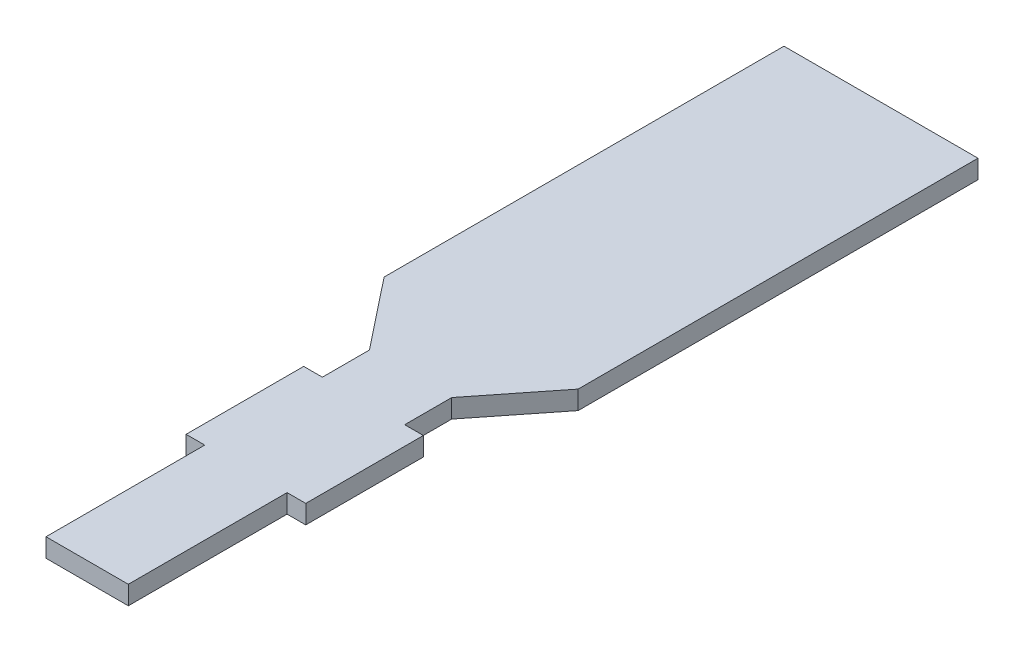
ISO-10303-21;
HEADER;
FILE_DESCRIPTION(('STEP AP214'),'2;1');
FILE_NAME('part.step','',(''),(''),'','','');
FILE_SCHEMA(('AUTOMOTIVE_DESIGN { 1 0 10303 214 1 1 1 1 }'));
ENDSEC;
DATA;
#1=APPLICATION_CONTEXT('core data for automotive mechanical design processes');
#2=APPLICATION_PROTOCOL_DEFINITION('international standard','automotive_design',2000,#1);
#3=PRODUCT_CONTEXT('',#1,'mechanical');
#4=PRODUCT('Part','Part','',(#3));
#5=PRODUCT_RELATED_PRODUCT_CATEGORY('part','',(#4));
#6=PRODUCT_DEFINITION_FORMATION('','',#4);
#7=PRODUCT_DEFINITION_CONTEXT('part definition',#1,'design');
#8=PRODUCT_DEFINITION('design','',#6,#7);
#9=PRODUCT_DEFINITION_SHAPE('','',#8);
#10=(LENGTH_UNIT() NAMED_UNIT(*) SI_UNIT(.MILLI.,.METRE.));
#11=(NAMED_UNIT(*) PLANE_ANGLE_UNIT() SI_UNIT($,.RADIAN.));
#12=(NAMED_UNIT(*) SI_UNIT($,.STERADIAN.) SOLID_ANGLE_UNIT());
#13=UNCERTAINTY_MEASURE_WITH_UNIT(LENGTH_MEASURE(1.E-05),#10,'distance_accuracy_value','');
#14=(GEOMETRIC_REPRESENTATION_CONTEXT(3) GLOBAL_UNCERTAINTY_ASSIGNED_CONTEXT((#13)) GLOBAL_UNIT_ASSIGNED_CONTEXT((#10,
#11,#12)) REPRESENTATION_CONTEXT('',''));
#15=CARTESIAN_POINT('',(0.,0.,0.));
#16=DIRECTION('',(0.,0.,1.));
#17=DIRECTION('',(1.,0.,0.));
#18=AXIS2_PLACEMENT_3D('',#15,#16,#17);
#19=CARTESIAN_POINT('',(16.5,3.175,0.));
#20=DIRECTION('',(-1.,0.,0.));
#21=DIRECTION('',(0.,0.,1.));
#22=AXIS2_PLACEMENT_3D('',#19,#20,#21);
#23=PLANE('',#22);
#24=DIRECTION('',(0.,0.,-1.));
#25=VECTOR('',#24,1.);
#26=CARTESIAN_POINT('',(16.5,0.,0.));
#27=LINE('',#26,#25);
#28=CARTESIAN_POINT('',(16.5,0.,68.));
#29=VERTEX_POINT('',#28);
#30=CARTESIAN_POINT('',(16.5,0.,0.));
#31=VERTEX_POINT('',#30);
#32=EDGE_CURVE('E176',#29,#31,#27,.T.);
#33=ORIENTED_EDGE('',*,*,#32,.T.);
#34=DIRECTION('',(0.,-1.,0.));
#35=VECTOR('',#34,1.);
#36=CARTESIAN_POINT('',(16.5,3.175,0.));
#37=LINE('',#36,#35);
#38=CARTESIAN_POINT('',(16.5,3.175,0.));
#39=VERTEX_POINT('',#38);
#40=EDGE_CURVE('E11',#39,#31,#37,.T.);
#41=ORIENTED_EDGE('',*,*,#40,.F.);
#42=DIRECTION('',(0.,0.,-1.));
#43=VECTOR('',#42,1.);
#44=CARTESIAN_POINT('',(16.5,3.175,0.));
#45=LINE('',#44,#43);
#46=CARTESIAN_POINT('',(16.5,3.175,68.));
#47=VERTEX_POINT('',#46);
#48=EDGE_CURVE('E206',#47,#39,#45,.T.);
#49=ORIENTED_EDGE('',*,*,#48,.F.);
#50=DIRECTION('',(0.,-1.,0.));
#51=VECTOR('',#50,1.);
#52=CARTESIAN_POINT('',(16.5,3.175,68.));
#53=LINE('',#52,#51);
#54=EDGE_CURVE('E172',#47,#29,#53,.T.);
#55=ORIENTED_EDGE('',*,*,#54,.T.);
#56=EDGE_LOOP('',(#33,#41,#49,#55));
#57=FACE_BOUND('',#56,.T.);
#58=ADVANCED_FACE('F32',(#57),#23,.F.);
#59=CARTESIAN_POINT('',(-16.5,3.175,0.));
#60=DIRECTION('',(0.,0.,1.));
#61=DIRECTION('',(1.,0.,0.));
#62=AXIS2_PLACEMENT_3D('',#59,#60,#61);
#63=PLANE('',#62);
#64=DIRECTION('',(-1.,0.,0.));
#65=VECTOR('',#64,1.);
#66=CARTESIAN_POINT('',(-16.5,0.,0.));
#67=LINE('',#66,#65);
#68=CARTESIAN_POINT('',(-16.5,0.,0.));
#69=VERTEX_POINT('',#68);
#70=EDGE_CURVE('E179',#31,#69,#67,.T.);
#71=ORIENTED_EDGE('',*,*,#70,.T.);
#72=DIRECTION('',(0.,-1.,0.));
#73=VECTOR('',#72,1.);
#74=CARTESIAN_POINT('',(-16.5,3.175,0.));
#75=LINE('',#74,#73);
#76=CARTESIAN_POINT('',(-16.5,3.175,0.));
#77=VERTEX_POINT('',#76);
#78=EDGE_CURVE('E40',#77,#69,#75,.T.);
#79=ORIENTED_EDGE('',*,*,#78,.F.);
#80=DIRECTION('',(-1.,0.,0.));
#81=VECTOR('',#80,1.);
#82=CARTESIAN_POINT('',(-16.5,3.175,0.));
#83=LINE('',#82,#81);
#84=EDGE_CURVE('E115',#39,#77,#83,.T.);
#85=ORIENTED_EDGE('',*,*,#84,.F.);
#86=ORIENTED_EDGE('',*,*,#40,.T.);
#87=EDGE_LOOP('',(#71,#79,#85,#86));
#88=FACE_BOUND('',#87,.T.);
#89=ADVANCED_FACE('F304',(#88),#63,.F.);
#90=CARTESIAN_POINT('',(-16.5,3.175,0.));
#91=DIRECTION('',(1.,0.,0.));
#92=DIRECTION('',(0.,0.,-1.));
#93=AXIS2_PLACEMENT_3D('',#90,#91,#92);
#94=PLANE('',#93);
#95=DIRECTION('',(0.,0.,1.));
#96=VECTOR('',#95,1.);
#97=CARTESIAN_POINT('',(-16.5,0.,0.));
#98=LINE('',#97,#96);
#99=CARTESIAN_POINT('',(-16.5,0.,68.));
#100=VERTEX_POINT('',#99);
#101=EDGE_CURVE('E181',#69,#100,#98,.T.);
#102=ORIENTED_EDGE('',*,*,#101,.T.);
#103=DIRECTION('',(0.,-1.,0.));
#104=VECTOR('',#103,1.);
#105=CARTESIAN_POINT('',(-16.5,3.175,68.));
#106=LINE('',#105,#104);
#107=CARTESIAN_POINT('',(-16.5,3.175,68.));
#108=VERTEX_POINT('',#107);
#109=EDGE_CURVE('E237',#108,#100,#106,.T.);
#110=ORIENTED_EDGE('',*,*,#109,.F.);
#111=DIRECTION('',(0.,0.,1.));
#112=VECTOR('',#111,1.);
#113=CARTESIAN_POINT('',(-16.5,3.175,0.));
#114=LINE('',#113,#112);
#115=EDGE_CURVE('E245',#77,#108,#114,.T.);
#116=ORIENTED_EDGE('',*,*,#115,.F.);
#117=ORIENTED_EDGE('',*,*,#78,.T.);
#118=EDGE_LOOP('',(#102,#110,#116,#117));
#119=FACE_BOUND('',#118,.T.);
#120=ADVANCED_FACE('F243',(#119),#94,.F.);
#121=CARTESIAN_POINT('',(-16.5,3.175,68.));
#122=DIRECTION('',(0.784045824461761,0.,-0.620702944365561));
#123=DIRECTION('',(-0.620702944365561,0.,-0.784045824461761));
#124=AXIS2_PLACEMENT_3D('',#121,#122,#123);
#125=PLANE('',#124);
#126=DIRECTION('',(0.620702944365561,0.,0.784045824461761));
#127=VECTOR('',#126,1.);
#128=CARTESIAN_POINT('',(-16.5,0.,68.));
#129=LINE('',#128,#127);
#130=CARTESIAN_POINT('',(-6.99999999999998,0.,80.));
#131=VERTEX_POINT('',#130);
#132=EDGE_CURVE('E183',#100,#131,#129,.T.);
#133=ORIENTED_EDGE('',*,*,#132,.T.);
#134=DIRECTION('',(0.,-1.,0.));
#135=VECTOR('',#134,1.);
#136=CARTESIAN_POINT('',(-6.99999999999998,3.175,80.));
#137=LINE('',#136,#135);
#138=CARTESIAN_POINT('',(-6.99999999999998,3.175,80.));
#139=VERTEX_POINT('',#138);
#140=EDGE_CURVE('E234',#139,#131,#137,.T.);
#141=ORIENTED_EDGE('',*,*,#140,.F.);
#142=DIRECTION('',(0.620702944365561,0.,0.784045824461761));
#143=VECTOR('',#142,1.);
#144=CARTESIAN_POINT('',(-16.5,3.175,68.));
#145=LINE('',#144,#143);
#146=EDGE_CURVE('E263',#108,#139,#145,.T.);
#147=ORIENTED_EDGE('',*,*,#146,.F.);
#148=ORIENTED_EDGE('',*,*,#109,.T.);
#149=EDGE_LOOP('',(#133,#141,#147,#148));
#150=FACE_BOUND('',#149,.T.);
#151=ADVANCED_FACE('F254',(#150),#125,.F.);
#152=CARTESIAN_POINT('',(-6.99999999999998,3.175,80.));
#153=DIRECTION('',(1.,0.,0.));
#154=DIRECTION('',(0.,0.,-1.));
#155=AXIS2_PLACEMENT_3D('',#152,#153,#154);
#156=PLANE('',#155);
#157=DIRECTION('',(0.,0.,1.));
#158=VECTOR('',#157,1.);
#159=CARTESIAN_POINT('',(-6.99999999999998,0.,80.));
#160=LINE('',#159,#158);
#161=CARTESIAN_POINT('',(-6.99999999999998,0.,88.));
#162=VERTEX_POINT('',#161);
#163=EDGE_CURVE('E185',#131,#162,#160,.T.);
#164=ORIENTED_EDGE('',*,*,#163,.T.);
#165=DIRECTION('',(0.,-1.,0.));
#166=VECTOR('',#165,1.);
#167=CARTESIAN_POINT('',(-6.99999999999998,3.175,88.));
#168=LINE('',#167,#166);
#169=CARTESIAN_POINT('',(-6.99999999999998,3.175,88.));
#170=VERTEX_POINT('',#169);
#171=EDGE_CURVE('E231',#170,#162,#168,.T.);
#172=ORIENTED_EDGE('',*,*,#171,.F.);
#173=DIRECTION('',(0.,0.,1.));
#174=VECTOR('',#173,1.);
#175=CARTESIAN_POINT('',(-6.99999999999998,3.175,80.));
#176=LINE('',#175,#174);
#177=EDGE_CURVE('E260',#139,#170,#176,.T.);
#178=ORIENTED_EDGE('',*,*,#177,.F.);
#179=ORIENTED_EDGE('',*,*,#140,.T.);
#180=EDGE_LOOP('',(#164,#172,#178,#179));
#181=FACE_BOUND('',#180,.T.);
#182=ADVANCED_FACE('F258',(#181),#156,.F.);
#183=CARTESIAN_POINT('',(-6.99999999999998,3.175,88.));
#184=DIRECTION('',(0.,0.,1.));
#185=DIRECTION('',(1.,0.,0.));
#186=AXIS2_PLACEMENT_3D('',#183,#184,#185);
#187=PLANE('',#186);
#188=DIRECTION('',(-1.,0.,0.));
#189=VECTOR('',#188,1.);
#190=CARTESIAN_POINT('',(-6.99999999999998,0.,88.));
#191=LINE('',#190,#189);
#192=CARTESIAN_POINT('',(-10.175,0.,88.));
#193=VERTEX_POINT('',#192);
#194=EDGE_CURVE('E187',#162,#193,#191,.T.);
#195=ORIENTED_EDGE('',*,*,#194,.T.);
#196=DIRECTION('',(0.,-1.,0.));
#197=VECTOR('',#196,1.);
#198=CARTESIAN_POINT('',(-10.175,3.175,88.));
#199=LINE('',#198,#197);
#200=CARTESIAN_POINT('',(-10.175,3.175,88.));
#201=VERTEX_POINT('',#200);
#202=EDGE_CURVE('E228',#201,#193,#199,.T.);
#203=ORIENTED_EDGE('',*,*,#202,.F.);
#204=DIRECTION('',(-1.,0.,0.));
#205=VECTOR('',#204,1.);
#206=CARTESIAN_POINT('',(-6.99999999999998,3.175,88.));
#207=LINE('',#206,#205);
#208=EDGE_CURVE('E262',#170,#201,#207,.T.);
#209=ORIENTED_EDGE('',*,*,#208,.F.);
#210=ORIENTED_EDGE('',*,*,#171,.T.);
#211=EDGE_LOOP('',(#195,#203,#209,#210));
#212=FACE_BOUND('',#211,.T.);
#213=ADVANCED_FACE('F317',(#212),#187,.F.);
#214=CARTESIAN_POINT('',(-10.175,3.175,88.));
#215=DIRECTION('',(1.,0.,0.));
#216=DIRECTION('',(0.,0.,-1.));
#217=AXIS2_PLACEMENT_3D('',#214,#215,#216);
#218=PLANE('',#217);
#219=DIRECTION('',(0.,0.,1.));
#220=VECTOR('',#219,1.);
#221=CARTESIAN_POINT('',(-10.175,0.,88.));
#222=LINE('',#221,#220);
#223=CARTESIAN_POINT('',(-10.175,0.,108.));
#224=VERTEX_POINT('',#223);
#225=EDGE_CURVE('E189',#193,#224,#222,.T.);
#226=ORIENTED_EDGE('',*,*,#225,.T.);
#227=DIRECTION('',(0.,-1.,0.));
#228=VECTOR('',#227,1.);
#229=CARTESIAN_POINT('',(-10.175,3.175,108.));
#230=LINE('',#229,#228);
#231=CARTESIAN_POINT('',(-10.175,3.175,108.));
#232=VERTEX_POINT('',#231);
#233=EDGE_CURVE('E225',#232,#224,#230,.T.);
#234=ORIENTED_EDGE('',*,*,#233,.F.);
#235=DIRECTION('',(0.,0.,1.));
#236=VECTOR('',#235,1.);
#237=CARTESIAN_POINT('',(-10.175,3.175,88.));
#238=LINE('',#237,#236);
#239=EDGE_CURVE('E265',#201,#232,#238,.T.);
#240=ORIENTED_EDGE('',*,*,#239,.F.);
#241=ORIENTED_EDGE('',*,*,#202,.T.);
#242=EDGE_LOOP('',(#226,#234,#240,#241));
#243=FACE_BOUND('',#242,.T.);
#244=ADVANCED_FACE('F320',(#243),#218,.F.);
#245=CARTESIAN_POINT('',(-10.175,3.175,108.));
#246=DIRECTION('',(0.,0.,-1.));
#247=DIRECTION('',(-1.,0.,0.));
#248=AXIS2_PLACEMENT_3D('',#245,#246,#247);
#249=PLANE('',#248);
#250=DIRECTION('',(1.,0.,0.));
#251=VECTOR('',#250,1.);
#252=CARTESIAN_POINT('',(-10.175,0.,108.));
#253=LINE('',#252,#251);
#254=CARTESIAN_POINT('',(-6.99999999999998,0.,108.));
#255=VERTEX_POINT('',#254);
#256=EDGE_CURVE('E191',#224,#255,#253,.T.);
#257=ORIENTED_EDGE('',*,*,#256,.T.);
#258=DIRECTION('',(0.,-1.,0.));
#259=VECTOR('',#258,1.);
#260=CARTESIAN_POINT('',(-6.99999999999998,3.175,108.));
#261=LINE('',#260,#259);
#262=CARTESIAN_POINT('',(-6.99999999999998,3.175,108.));
#263=VERTEX_POINT('',#262);
#264=EDGE_CURVE('E222',#263,#255,#261,.T.);
#265=ORIENTED_EDGE('',*,*,#264,.F.);
#266=DIRECTION('',(1.,0.,0.));
#267=VECTOR('',#266,1.);
#268=CARTESIAN_POINT('',(-10.175,3.175,108.));
#269=LINE('',#268,#267);
#270=EDGE_CURVE('E271',#232,#263,#269,.T.);
#271=ORIENTED_EDGE('',*,*,#270,.F.);
#272=ORIENTED_EDGE('',*,*,#233,.T.);
#273=EDGE_LOOP('',(#257,#265,#271,#272));
#274=FACE_BOUND('',#273,.T.);
#275=ADVANCED_FACE('F324',(#274),#249,.F.);
#276=CARTESIAN_POINT('',(-6.99999999999998,3.175,108.));
#277=DIRECTION('',(1.,0.,0.));
#278=DIRECTION('',(0.,0.,-1.));
#279=AXIS2_PLACEMENT_3D('',#276,#277,#278);
#280=PLANE('',#279);
#281=DIRECTION('',(0.,0.,1.));
#282=VECTOR('',#281,1.);
#283=CARTESIAN_POINT('',(-6.99999999999998,0.,108.));
#284=LINE('',#283,#282);
#285=CARTESIAN_POINT('',(-6.99999999999998,0.,135.));
#286=VERTEX_POINT('',#285);
#287=EDGE_CURVE('E193',#255,#286,#284,.T.);
#288=ORIENTED_EDGE('',*,*,#287,.T.);
#289=DIRECTION('',(0.,-1.,0.));
#290=VECTOR('',#289,1.);
#291=CARTESIAN_POINT('',(-6.99999999999998,3.175,135.));
#292=LINE('',#291,#290);
#293=CARTESIAN_POINT('',(-6.99999999999998,3.175,135.));
#294=VERTEX_POINT('',#293);
#295=EDGE_CURVE('E219',#294,#286,#292,.T.);
#296=ORIENTED_EDGE('',*,*,#295,.F.);
#297=DIRECTION('',(0.,0.,1.));
#298=VECTOR('',#297,1.);
#299=CARTESIAN_POINT('',(-6.99999999999998,3.175,108.));
#300=LINE('',#299,#298);
#301=EDGE_CURVE('E273',#263,#294,#300,.T.);
#302=ORIENTED_EDGE('',*,*,#301,.F.);
#303=ORIENTED_EDGE('',*,*,#264,.T.);
#304=EDGE_LOOP('',(#288,#296,#302,#303));
#305=FACE_BOUND('',#304,.T.);
#306=ADVANCED_FACE('F328',(#305),#280,.F.);
#307=CARTESIAN_POINT('',(7.00000000000002,3.175,135.));
#308=DIRECTION('',(0.,0.,-1.));
#309=DIRECTION('',(-1.,0.,0.));
#310=AXIS2_PLACEMENT_3D('',#307,#308,#309);
#311=PLANE('',#310);
#312=DIRECTION('',(1.,0.,0.));
#313=VECTOR('',#312,1.);
#314=CARTESIAN_POINT('',(7.00000000000002,0.,135.));
#315=LINE('',#314,#313);
#316=CARTESIAN_POINT('',(7.00000000000002,0.,135.));
#317=VERTEX_POINT('',#316);
#318=EDGE_CURVE('E195',#286,#317,#315,.T.);
#319=ORIENTED_EDGE('',*,*,#318,.T.);
#320=DIRECTION('',(0.,-1.,0.));
#321=VECTOR('',#320,1.);
#322=CARTESIAN_POINT('',(7.00000000000002,3.175,135.));
#323=LINE('',#322,#321);
#324=CARTESIAN_POINT('',(7.00000000000002,3.175,135.));
#325=VERTEX_POINT('',#324);
#326=EDGE_CURVE('E216',#325,#317,#323,.T.);
#327=ORIENTED_EDGE('',*,*,#326,.F.);
#328=DIRECTION('',(1.,0.,0.));
#329=VECTOR('',#328,1.);
#330=CARTESIAN_POINT('',(7.00000000000002,3.175,135.));
#331=LINE('',#330,#329);
#332=EDGE_CURVE('E275',#294,#325,#331,.T.);
#333=ORIENTED_EDGE('',*,*,#332,.F.);
#334=ORIENTED_EDGE('',*,*,#295,.T.);
#335=EDGE_LOOP('',(#319,#327,#333,#334));
#336=FACE_BOUND('',#335,.T.);
#337=ADVANCED_FACE('F332',(#336),#311,.F.);
#338=CARTESIAN_POINT('',(7.00000000000001,3.175,108.));
#339=DIRECTION('',(-1.,0.,0.));
#340=DIRECTION('',(0.,0.,1.));
#341=AXIS2_PLACEMENT_3D('',#338,#339,#340);
#342=PLANE('',#341);
#343=DIRECTION('',(0.,0.,-1.));
#344=VECTOR('',#343,1.);
#345=CARTESIAN_POINT('',(7.00000000000001,0.,108.));
#346=LINE('',#345,#344);
#347=CARTESIAN_POINT('',(7.00000000000001,0.,108.));
#348=VERTEX_POINT('',#347);
#349=EDGE_CURVE('E197',#317,#348,#346,.T.);
#350=ORIENTED_EDGE('',*,*,#349,.T.);
#351=DIRECTION('',(0.,-1.,0.));
#352=VECTOR('',#351,1.);
#353=CARTESIAN_POINT('',(7.00000000000001,3.175,108.));
#354=LINE('',#353,#352);
#355=CARTESIAN_POINT('',(7.00000000000001,3.175,108.));
#356=VERTEX_POINT('',#355);
#357=EDGE_CURVE('E213',#356,#348,#354,.T.);
#358=ORIENTED_EDGE('',*,*,#357,.F.);
#359=DIRECTION('',(0.,0.,-1.));
#360=VECTOR('',#359,1.);
#361=CARTESIAN_POINT('',(7.00000000000001,3.175,108.));
#362=LINE('',#361,#360);
#363=EDGE_CURVE('E277',#325,#356,#362,.T.);
#364=ORIENTED_EDGE('',*,*,#363,.F.);
#365=ORIENTED_EDGE('',*,*,#326,.T.);
#366=EDGE_LOOP('',(#350,#358,#364,#365));
#367=FACE_BOUND('',#366,.T.);
#368=ADVANCED_FACE('F336',(#367),#342,.F.);
#369=CARTESIAN_POINT('',(10.175,3.175,108.));
#370=DIRECTION('',(0.,0.,-1.));
#371=DIRECTION('',(-1.,0.,0.));
#372=AXIS2_PLACEMENT_3D('',#369,#370,#371);
#373=PLANE('',#372);
#374=DIRECTION('',(1.,0.,0.));
#375=VECTOR('',#374,1.);
#376=CARTESIAN_POINT('',(10.175,0.,108.));
#377=LINE('',#376,#375);
#378=CARTESIAN_POINT('',(10.175,0.,108.));
#379=VERTEX_POINT('',#378);
#380=EDGE_CURVE('E199',#348,#379,#377,.T.);
#381=ORIENTED_EDGE('',*,*,#380,.T.);
#382=DIRECTION('',(0.,-1.,0.));
#383=VECTOR('',#382,1.);
#384=CARTESIAN_POINT('',(10.175,3.175,108.));
#385=LINE('',#384,#383);
#386=CARTESIAN_POINT('',(10.175,3.175,108.));
#387=VERTEX_POINT('',#386);
#388=EDGE_CURVE('E210',#387,#379,#385,.T.);
#389=ORIENTED_EDGE('',*,*,#388,.F.);
#390=DIRECTION('',(1.,0.,0.));
#391=VECTOR('',#390,1.);
#392=CARTESIAN_POINT('',(10.175,3.175,108.));
#393=LINE('',#392,#391);
#394=EDGE_CURVE('E279',#356,#387,#393,.T.);
#395=ORIENTED_EDGE('',*,*,#394,.F.);
#396=ORIENTED_EDGE('',*,*,#357,.T.);
#397=EDGE_LOOP('',(#381,#389,#395,#396));
#398=FACE_BOUND('',#397,.T.);
#399=ADVANCED_FACE('F285',(#398),#373,.F.);
#400=CARTESIAN_POINT('',(10.175,3.175,88.));
#401=DIRECTION('',(-1.,0.,0.));
#402=DIRECTION('',(0.,0.,1.));
#403=AXIS2_PLACEMENT_3D('',#400,#401,#402);
#404=PLANE('',#403);
#405=DIRECTION('',(0.,0.,-1.));
#406=VECTOR('',#405,1.);
#407=CARTESIAN_POINT('',(10.175,0.,88.));
#408=LINE('',#407,#406);
#409=CARTESIAN_POINT('',(10.175,0.,88.));
#410=VERTEX_POINT('',#409);
#411=EDGE_CURVE('E201',#379,#410,#408,.T.);
#412=ORIENTED_EDGE('',*,*,#411,.T.);
#413=DIRECTION('',(0.,-1.,0.));
#414=VECTOR('',#413,1.);
#415=CARTESIAN_POINT('',(10.175,3.175,88.));
#416=LINE('',#415,#414);
#417=CARTESIAN_POINT('',(10.175,3.175,88.));
#418=VERTEX_POINT('',#417);
#419=EDGE_CURVE('E167',#418,#410,#416,.T.);
#420=ORIENTED_EDGE('',*,*,#419,.F.);
#421=DIRECTION('',(0.,0.,-1.));
#422=VECTOR('',#421,1.);
#423=CARTESIAN_POINT('',(10.175,3.175,88.));
#424=LINE('',#423,#422);
#425=EDGE_CURVE('E158',#387,#418,#424,.T.);
#426=ORIENTED_EDGE('',*,*,#425,.F.);
#427=ORIENTED_EDGE('',*,*,#388,.T.);
#428=EDGE_LOOP('',(#412,#420,#426,#427));
#429=FACE_BOUND('',#428,.T.);
#430=ADVANCED_FACE('F289',(#429),#404,.F.);
#431=CARTESIAN_POINT('',(7.,3.175,88.));
#432=DIRECTION('',(0.,0.,1.));
#433=DIRECTION('',(1.,0.,0.));
#434=AXIS2_PLACEMENT_3D('',#431,#432,#433);
#435=PLANE('',#434);
#436=DIRECTION('',(-1.,0.,0.));
#437=VECTOR('',#436,1.);
#438=CARTESIAN_POINT('',(7.,0.,88.));
#439=LINE('',#438,#437);
#440=CARTESIAN_POINT('',(7.,0.,88.));
#441=VERTEX_POINT('',#440);
#442=EDGE_CURVE('E166',#410,#441,#439,.T.);
#443=ORIENTED_EDGE('',*,*,#442,.T.);
#444=DIRECTION('',(0.,-1.,0.));
#445=VECTOR('',#444,1.);
#446=CARTESIAN_POINT('',(7.,3.175,88.));
#447=LINE('',#446,#445);
#448=CARTESIAN_POINT('',(7.,3.175,88.));
#449=VERTEX_POINT('',#448);
#450=EDGE_CURVE('E163',#449,#441,#447,.T.);
#451=ORIENTED_EDGE('',*,*,#450,.F.);
#452=DIRECTION('',(-1.,0.,0.));
#453=VECTOR('',#452,1.);
#454=CARTESIAN_POINT('',(7.,3.175,88.));
#455=LINE('',#454,#453);
#456=EDGE_CURVE('E152',#418,#449,#455,.T.);
#457=ORIENTED_EDGE('',*,*,#456,.F.);
#458=ORIENTED_EDGE('',*,*,#419,.T.);
#459=EDGE_LOOP('',(#443,#451,#457,#458));
#460=FACE_BOUND('',#459,.T.);
#461=ADVANCED_FACE('F164',(#460),#435,.F.);
#462=CARTESIAN_POINT('',(7.,3.175,80.));
#463=DIRECTION('',(-1.,0.,0.));
#464=DIRECTION('',(0.,0.,1.));
#465=AXIS2_PLACEMENT_3D('',#462,#463,#464);
#466=PLANE('',#465);
#467=DIRECTION('',(0.,0.,-1.));
#468=VECTOR('',#467,1.);
#469=CARTESIAN_POINT('',(7.,0.,80.));
#470=LINE('',#469,#468);
#471=CARTESIAN_POINT('',(7.,0.,80.));
#472=VERTEX_POINT('',#471);
#473=EDGE_CURVE('E101',#441,#472,#470,.T.);
#474=ORIENTED_EDGE('',*,*,#473,.T.);
#475=DIRECTION('',(0.,-1.,0.));
#476=VECTOR('',#475,1.);
#477=CARTESIAN_POINT('',(7.,3.175,80.));
#478=LINE('',#477,#476);
#479=CARTESIAN_POINT('',(7.,3.175,80.));
#480=VERTEX_POINT('',#479);
#481=EDGE_CURVE('E168',#480,#472,#478,.T.);
#482=ORIENTED_EDGE('',*,*,#481,.F.);
#483=DIRECTION('',(0.,0.,-1.));
#484=VECTOR('',#483,1.);
#485=CARTESIAN_POINT('',(7.,3.175,80.));
#486=LINE('',#485,#484);
#487=EDGE_CURVE('E156',#449,#480,#486,.T.);
#488=ORIENTED_EDGE('',*,*,#487,.F.);
#489=ORIENTED_EDGE('',*,*,#450,.T.);
#490=EDGE_LOOP('',(#474,#482,#488,#489));
#491=FACE_BOUND('',#490,.T.);
#492=ADVANCED_FACE('F170',(#491),#466,.F.);
#493=CARTESIAN_POINT('',(16.5,3.175,68.));
#494=DIRECTION('',(-0.784045824461761,0.,-0.620702944365561));
#495=DIRECTION('',(-0.620702944365561,0.,0.784045824461761));
#496=AXIS2_PLACEMENT_3D('',#493,#494,#495);
#497=PLANE('',#496);
#498=DIRECTION('',(0.620702944365561,0.,-0.784045824461761));
#499=VECTOR('',#498,1.);
#500=CARTESIAN_POINT('',(16.5,0.,68.));
#501=LINE('',#500,#499);
#502=EDGE_CURVE('E107',#472,#29,#501,.T.);
#503=ORIENTED_EDGE('',*,*,#502,.T.);
#504=ORIENTED_EDGE('',*,*,#54,.F.);
#505=DIRECTION('',(0.620702944365561,0.,-0.784045824461761));
#506=VECTOR('',#505,1.);
#507=CARTESIAN_POINT('',(16.5,3.175,68.));
#508=LINE('',#507,#506);
#509=EDGE_CURVE('E48',#480,#47,#508,.T.);
#510=ORIENTED_EDGE('',*,*,#509,.F.);
#511=ORIENTED_EDGE('',*,*,#481,.T.);
#512=EDGE_LOOP('',(#503,#504,#510,#511));
#513=FACE_BOUND('',#512,.T.);
#514=ADVANCED_FACE('F293',(#513),#497,.F.);
#515=CARTESIAN_POINT('',(0.,3.175,0.));
#516=DIRECTION('',(0.,1.,0.));
#517=DIRECTION('',(0.,0.,1.));
#518=AXIS2_PLACEMENT_3D('',#515,#516,#517);
#519=PLANE('',#518);
#520=ORIENTED_EDGE('',*,*,#48,.T.);
#521=ORIENTED_EDGE('',*,*,#84,.T.);
#522=ORIENTED_EDGE('',*,*,#115,.T.);
#523=ORIENTED_EDGE('',*,*,#146,.T.);
#524=ORIENTED_EDGE('',*,*,#177,.T.);
#525=ORIENTED_EDGE('',*,*,#208,.T.);
#526=ORIENTED_EDGE('',*,*,#239,.T.);
#527=ORIENTED_EDGE('',*,*,#270,.T.);
#528=ORIENTED_EDGE('',*,*,#301,.T.);
#529=ORIENTED_EDGE('',*,*,#332,.T.);
#530=ORIENTED_EDGE('',*,*,#363,.T.);
#531=ORIENTED_EDGE('',*,*,#394,.T.);
#532=ORIENTED_EDGE('',*,*,#425,.T.);
#533=ORIENTED_EDGE('',*,*,#456,.T.);
#534=ORIENTED_EDGE('',*,*,#487,.T.);
#535=ORIENTED_EDGE('',*,*,#509,.T.);
#536=EDGE_LOOP('',(#520,#521,#522,#523,#524,#525,#526,#527,#528,#529,#530,#531,#532,#533,#534,#535));
#537=FACE_BOUND('',#536,.T.);
#538=ADVANCED_FACE('F154',(#537),#519,.T.);
#539=CARTESIAN_POINT('',(0.,0.,0.));
#540=DIRECTION('',(0.,1.,0.));
#541=DIRECTION('',(0.,0.,1.));
#542=AXIS2_PLACEMENT_3D('',#539,#540,#541);
#543=PLANE('',#542);
#544=ORIENTED_EDGE('',*,*,#32,.F.);
#545=ORIENTED_EDGE('',*,*,#502,.F.);
#546=ORIENTED_EDGE('',*,*,#473,.F.);
#547=ORIENTED_EDGE('',*,*,#442,.F.);
#548=ORIENTED_EDGE('',*,*,#411,.F.);
#549=ORIENTED_EDGE('',*,*,#380,.F.);
#550=ORIENTED_EDGE('',*,*,#349,.F.);
#551=ORIENTED_EDGE('',*,*,#318,.F.);
#552=ORIENTED_EDGE('',*,*,#287,.F.);
#553=ORIENTED_EDGE('',*,*,#256,.F.);
#554=ORIENTED_EDGE('',*,*,#225,.F.);
#555=ORIENTED_EDGE('',*,*,#194,.F.);
#556=ORIENTED_EDGE('',*,*,#163,.F.);
#557=ORIENTED_EDGE('',*,*,#132,.F.);
#558=ORIENTED_EDGE('',*,*,#101,.F.);
#559=ORIENTED_EDGE('',*,*,#70,.F.);
#560=EDGE_LOOP('',(#544,#545,#546,#547,#548,#549,#550,#551,#552,#553,#554,#555,#556,#557,#558,#559));
#561=FACE_BOUND('',#560,.T.);
#562=ADVANCED_FACE('F249',(#561),#543,.F.);
#563=CLOSED_SHELL('',(#58,#89,#120,#151,#182,#213,#244,#275,#306,#337,#368,#399,#430,#461,#492,
#514,#538,#562));
#564=MANIFOLD_SOLID_BREP('B2',#563);
#565=ADVANCED_BREP_SHAPE_REPRESENTATION('',(#18,#564),#14);
#566=SHAPE_DEFINITION_REPRESENTATION(#9,#565);
ENDSEC;
END-ISO-10303-21;
